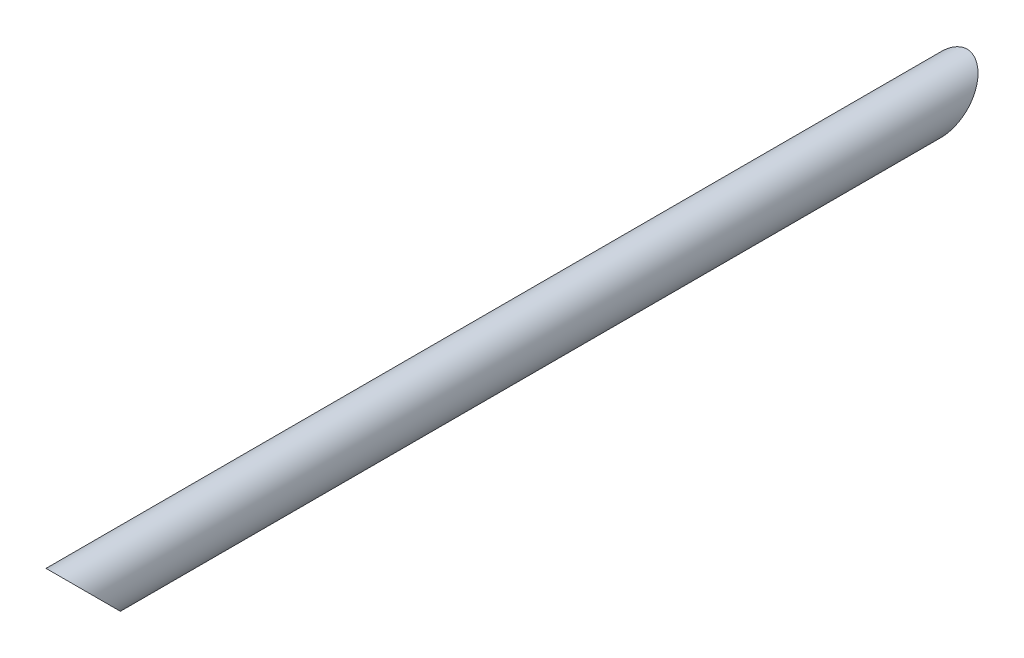
ISO-10303-21;
HEADER;
FILE_DESCRIPTION(('STEP AP214'),'2;1');
FILE_NAME('part.step','',(''),(''),'','','');
FILE_SCHEMA(('AUTOMOTIVE_DESIGN { 1 0 10303 214 1 1 1 1 }'));
ENDSEC;
DATA;
#1=APPLICATION_CONTEXT('core data for automotive mechanical design processes');
#2=APPLICATION_PROTOCOL_DEFINITION('international standard','automotive_design',2000,#1);
#3=PRODUCT_CONTEXT('',#1,'mechanical');
#4=PRODUCT('Part','Part','',(#3));
#5=PRODUCT_RELATED_PRODUCT_CATEGORY('part','',(#4));
#6=PRODUCT_DEFINITION_FORMATION('','',#4);
#7=PRODUCT_DEFINITION_CONTEXT('part definition',#1,'design');
#8=PRODUCT_DEFINITION('design','',#6,#7);
#9=PRODUCT_DEFINITION_SHAPE('','',#8);
#10=(LENGTH_UNIT() NAMED_UNIT(*) SI_UNIT(.MILLI.,.METRE.));
#11=(NAMED_UNIT(*) PLANE_ANGLE_UNIT() SI_UNIT($,.RADIAN.));
#12=(NAMED_UNIT(*) SI_UNIT($,.STERADIAN.) SOLID_ANGLE_UNIT());
#13=UNCERTAINTY_MEASURE_WITH_UNIT(LENGTH_MEASURE(1.E-05),#10,'distance_accuracy_value','');
#14=(GEOMETRIC_REPRESENTATION_CONTEXT(3) GLOBAL_UNCERTAINTY_ASSIGNED_CONTEXT((#13)) GLOBAL_UNIT_ASSIGNED_CONTEXT((#10,
#11,#12)) REPRESENTATION_CONTEXT('',''));
#15=CARTESIAN_POINT('',(0.,0.,0.));
#16=DIRECTION('',(0.,0.,1.));
#17=DIRECTION('',(1.,0.,0.));
#18=AXIS2_PLACEMENT_3D('',#15,#16,#17);
#19=CARTESIAN_POINT('',(0.,0.,933.45));
#20=DIRECTION('',(0.,0.,-1.));
#21=DIRECTION('',(-1.,0.,0.));
#22=AXIS2_PLACEMENT_3D('',#19,#20,#21);
#23=CYLINDRICAL_SURFACE('',#22,26.9875);
#24=CARTESIAN_POINT('',(0.,0.,26.9874999999999));
#25=DIRECTION('',(0.,0.707106781186547,0.707106781186547));
#26=DIRECTION('',(0.,0.707106781186548,-0.707106781186548));
#27=AXIS2_PLACEMENT_3D('',#24,#25,#26);
#28=ELLIPSE('',#27,38.1660885145439,26.9875);
#29=CARTESIAN_POINT('',(0.,26.9875,0.));
#30=VERTEX_POINT('',#29);
#31=EDGE_CURVE('E44',#30,#30,#28,.T.);
#32=ORIENTED_EDGE('',*,*,#31,.T.);
#33=EDGE_LOOP('',(#32));
#34=FACE_BOUND('',#33,.T.);
#35=CARTESIAN_POINT('',(0.,0.,906.4625));
#36=DIRECTION('',(0.,0.707106781186547,-0.707106781186547));
#37=DIRECTION('',(0.,-0.707106781186548,-0.707106781186548));
#38=AXIS2_PLACEMENT_3D('',#35,#36,#37);
#39=ELLIPSE('',#38,38.1660885145439,26.9875);
#40=CARTESIAN_POINT('',(0.,-26.9875,879.475));
#41=VERTEX_POINT('',#40);
#42=EDGE_CURVE('E10',#41,#41,#39,.T.);
#43=ORIENTED_EDGE('',*,*,#42,.T.);
#44=EDGE_LOOP('',(#43));
#45=FACE_BOUND('',#44,.T.);
#46=ADVANCED_FACE('F38',(#34,#45),#23,.T.);
#47=CARTESIAN_POINT('',(-26.9875,26.9875,0.));
#48=DIRECTION('',(0.,0.707106781186547,0.707106781186547));
#49=DIRECTION('',(0.,-0.707106781186548,0.707106781186548));
#50=AXIS2_PLACEMENT_3D('',#47,#48,#49);
#51=PLANE('',#50);
#52=ORIENTED_EDGE('',*,*,#31,.F.);
#53=EDGE_LOOP('',(#52));
#54=FACE_BOUND('',#53,.T.);
#55=ADVANCED_FACE('F51',(#54),#51,.F.);
#56=CARTESIAN_POINT('',(-26.9875,26.9875,933.45));
#57=DIRECTION('',(0.,0.707106781186547,-0.707106781186547));
#58=DIRECTION('',(0.,0.707106781186548,0.707106781186548));
#59=AXIS2_PLACEMENT_3D('',#56,#57,#58);
#60=PLANE('',#59);
#61=ORIENTED_EDGE('',*,*,#42,.F.);
#62=EDGE_LOOP('',(#61));
#63=FACE_BOUND('',#62,.T.);
#64=ADVANCED_FACE('F53',(#63),#60,.F.);
#65=CLOSED_SHELL('',(#46,#55,#64));
#66=MANIFOLD_SOLID_BREP('B2',#65);
#67=ADVANCED_BREP_SHAPE_REPRESENTATION('',(#18,#66),#14);
#68=SHAPE_DEFINITION_REPRESENTATION(#9,#67);
ENDSEC;
END-ISO-10303-21;
